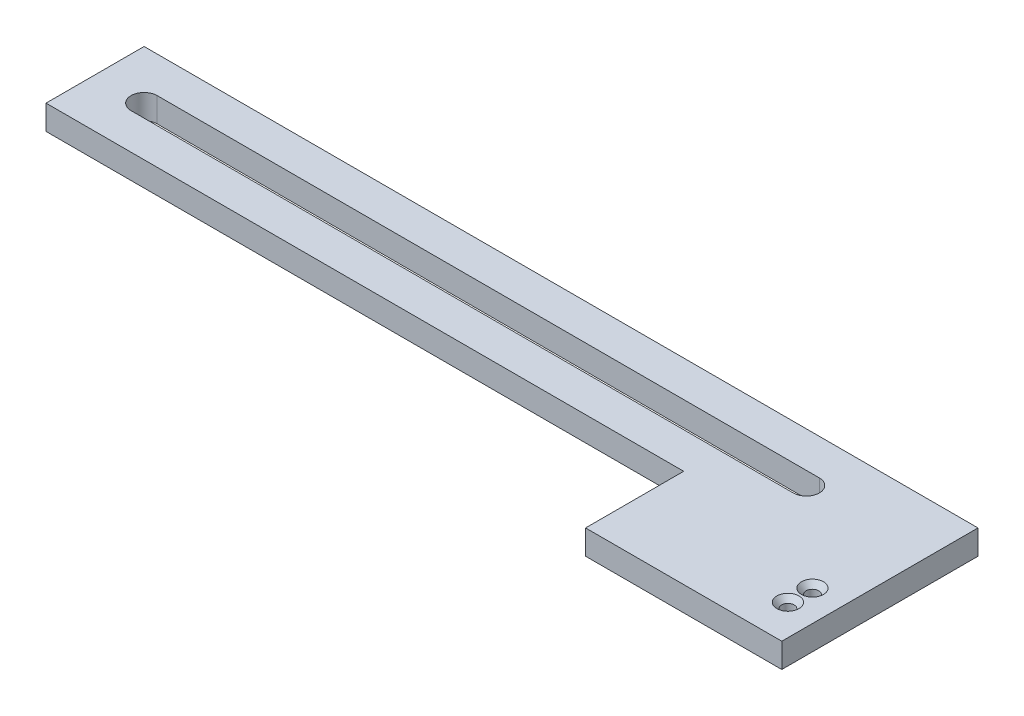
ISO-10303-21;
HEADER;
FILE_DESCRIPTION(('STEP AP214'),'2;1');
FILE_NAME('part.step','',(''),(''),'','','');
FILE_SCHEMA(('AUTOMOTIVE_DESIGN { 1 0 10303 214 1 1 1 1 }'));
ENDSEC;
DATA;
#1=APPLICATION_CONTEXT('core data for automotive mechanical design processes');
#2=APPLICATION_PROTOCOL_DEFINITION('international standard','automotive_design',2000,#1);
#3=PRODUCT_CONTEXT('',#1,'mechanical');
#4=PRODUCT('Part','Part','',(#3));
#5=PRODUCT_RELATED_PRODUCT_CATEGORY('part','',(#4));
#6=PRODUCT_DEFINITION_FORMATION('','',#4);
#7=PRODUCT_DEFINITION_CONTEXT('part definition',#1,'design');
#8=PRODUCT_DEFINITION('design','',#6,#7);
#9=PRODUCT_DEFINITION_SHAPE('','',#8);
#10=(LENGTH_UNIT() NAMED_UNIT(*) SI_UNIT(.MILLI.,.METRE.));
#11=(NAMED_UNIT(*) PLANE_ANGLE_UNIT() SI_UNIT($,.RADIAN.));
#12=(NAMED_UNIT(*) SI_UNIT($,.STERADIAN.) SOLID_ANGLE_UNIT());
#13=UNCERTAINTY_MEASURE_WITH_UNIT(LENGTH_MEASURE(1.E-05),#10,'distance_accuracy_value','');
#14=(GEOMETRIC_REPRESENTATION_CONTEXT(3) GLOBAL_UNCERTAINTY_ASSIGNED_CONTEXT((#13)) GLOBAL_UNIT_ASSIGNED_CONTEXT((#10,
#11,#12)) REPRESENTATION_CONTEXT('',''));
#15=CARTESIAN_POINT('',(0.,0.,0.));
#16=DIRECTION('',(0.,0.,1.));
#17=DIRECTION('',(1.,0.,0.));
#18=AXIS2_PLACEMENT_3D('',#15,#16,#17);
#19=CARTESIAN_POINT('',(0.,6.35,25.4));
#20=DIRECTION('',(1.,0.,0.));
#21=DIRECTION('',(0.,0.,-1.));
#22=AXIS2_PLACEMENT_3D('',#19,#20,#21);
#23=PLANE('',#22);
#24=DIRECTION('',(0.,0.,1.));
#25=VECTOR('',#24,1.);
#26=CARTESIAN_POINT('',(0.,0.,25.4));
#27=LINE('',#26,#25);
#28=CARTESIAN_POINT('',(0.,0.,0.));
#29=VERTEX_POINT('',#28);
#30=CARTESIAN_POINT('',(0.,0.,25.4));
#31=VERTEX_POINT('',#30);
#32=EDGE_CURVE('E173',#29,#31,#27,.T.);
#33=ORIENTED_EDGE('',*,*,#32,.T.);
#34=DIRECTION('',(0.,-1.,0.));
#35=VECTOR('',#34,1.);
#36=CARTESIAN_POINT('',(0.,6.35,25.4));
#37=LINE('',#36,#35);
#38=CARTESIAN_POINT('',(0.,6.35,25.4));
#39=VERTEX_POINT('',#38);
#40=EDGE_CURVE('E11',#39,#31,#37,.T.);
#41=ORIENTED_EDGE('',*,*,#40,.F.);
#42=DIRECTION('',(0.,0.,1.));
#43=VECTOR('',#42,1.);
#44=CARTESIAN_POINT('',(0.,6.35,25.4));
#45=LINE('',#44,#43);
#46=CARTESIAN_POINT('',(0.,6.35,0.));
#47=VERTEX_POINT('',#46);
#48=EDGE_CURVE('E177',#47,#39,#45,.T.);
#49=ORIENTED_EDGE('',*,*,#48,.F.);
#50=DIRECTION('',(0.,-1.,0.));
#51=VECTOR('',#50,1.);
#52=CARTESIAN_POINT('',(0.,6.35,0.));
#53=LINE('',#52,#51);
#54=EDGE_CURVE('E196',#47,#29,#53,.T.);
#55=ORIENTED_EDGE('',*,*,#54,.T.);
#56=EDGE_LOOP('',(#33,#41,#49,#55));
#57=FACE_BOUND('',#56,.T.);
#58=ADVANCED_FACE('F41',(#57),#23,.F.);
#59=CARTESIAN_POINT('',(165.1,6.35,25.4));
#60=DIRECTION('',(0.,0.,-1.));
#61=DIRECTION('',(-1.,0.,0.));
#62=AXIS2_PLACEMENT_3D('',#59,#60,#61);
#63=PLANE('',#62);
#64=DIRECTION('',(1.,0.,0.));
#65=VECTOR('',#64,1.);
#66=CARTESIAN_POINT('',(165.1,0.,25.4));
#67=LINE('',#66,#65);
#68=CARTESIAN_POINT('',(165.1,0.,25.4));
#69=VERTEX_POINT('',#68);
#70=EDGE_CURVE('E199',#31,#69,#67,.T.);
#71=ORIENTED_EDGE('',*,*,#70,.T.);
#72=DIRECTION('',(0.,-1.,0.));
#73=VECTOR('',#72,1.);
#74=CARTESIAN_POINT('',(165.1,6.35,25.4));
#75=LINE('',#74,#73);
#76=CARTESIAN_POINT('',(165.1,6.35,25.4));
#77=VERTEX_POINT('',#76);
#78=EDGE_CURVE('E48',#77,#69,#75,.T.);
#79=ORIENTED_EDGE('',*,*,#78,.F.);
#80=DIRECTION('',(1.,0.,0.));
#81=VECTOR('',#80,1.);
#82=CARTESIAN_POINT('',(165.1,6.35,25.4));
#83=LINE('',#82,#81);
#84=EDGE_CURVE('E180',#39,#77,#83,.T.);
#85=ORIENTED_EDGE('',*,*,#84,.F.);
#86=ORIENTED_EDGE('',*,*,#40,.T.);
#87=EDGE_LOOP('',(#71,#79,#85,#86));
#88=FACE_BOUND('',#87,.T.);
#89=ADVANCED_FACE('F253',(#88),#63,.F.);
#90=CARTESIAN_POINT('',(165.1,6.35,50.8));
#91=DIRECTION('',(1.,0.,0.));
#92=DIRECTION('',(0.,0.,-1.));
#93=AXIS2_PLACEMENT_3D('',#90,#91,#92);
#94=PLANE('',#93);
#95=DIRECTION('',(0.,0.,1.));
#96=VECTOR('',#95,1.);
#97=CARTESIAN_POINT('',(165.1,0.,50.8));
#98=LINE('',#97,#96);
#99=CARTESIAN_POINT('',(165.1,0.,50.8));
#100=VERTEX_POINT('',#99);
#101=EDGE_CURVE('E202',#69,#100,#98,.T.);
#102=ORIENTED_EDGE('',*,*,#101,.T.);
#103=DIRECTION('',(0.,-1.,0.));
#104=VECTOR('',#103,1.);
#105=CARTESIAN_POINT('',(165.1,6.35,50.8));
#106=LINE('',#105,#104);
#107=CARTESIAN_POINT('',(165.1,6.35,50.8));
#108=VERTEX_POINT('',#107);
#109=EDGE_CURVE('E223',#108,#100,#106,.T.);
#110=ORIENTED_EDGE('',*,*,#109,.F.);
#111=DIRECTION('',(0.,0.,1.));
#112=VECTOR('',#111,1.);
#113=CARTESIAN_POINT('',(165.1,6.35,50.8));
#114=LINE('',#113,#112);
#115=EDGE_CURVE('E184',#77,#108,#114,.T.);
#116=ORIENTED_EDGE('',*,*,#115,.F.);
#117=ORIENTED_EDGE('',*,*,#78,.T.);
#118=EDGE_LOOP('',(#102,#110,#116,#117));
#119=FACE_BOUND('',#118,.T.);
#120=ADVANCED_FACE('F232',(#119),#94,.F.);
#121=CARTESIAN_POINT('',(215.9,6.35,50.8));
#122=DIRECTION('',(0.,0.,-1.));
#123=DIRECTION('',(-1.,0.,0.));
#124=AXIS2_PLACEMENT_3D('',#121,#122,#123);
#125=PLANE('',#124);
#126=DIRECTION('',(1.,0.,0.));
#127=VECTOR('',#126,1.);
#128=CARTESIAN_POINT('',(215.9,0.,50.8));
#129=LINE('',#128,#127);
#130=CARTESIAN_POINT('',(215.9,0.,50.8));
#131=VERTEX_POINT('',#130);
#132=EDGE_CURVE('E205',#100,#131,#129,.T.);
#133=ORIENTED_EDGE('',*,*,#132,.T.);
#134=DIRECTION('',(0.,-1.,0.));
#135=VECTOR('',#134,1.);
#136=CARTESIAN_POINT('',(215.9,6.35,50.8));
#137=LINE('',#136,#135);
#138=CARTESIAN_POINT('',(215.9,6.35,50.8));
#139=VERTEX_POINT('',#138);
#140=EDGE_CURVE('E219',#139,#131,#137,.T.);
#141=ORIENTED_EDGE('',*,*,#140,.F.);
#142=DIRECTION('',(1.,0.,0.));
#143=VECTOR('',#142,1.);
#144=CARTESIAN_POINT('',(215.9,6.35,50.8));
#145=LINE('',#144,#143);
#146=EDGE_CURVE('E187',#108,#139,#145,.T.);
#147=ORIENTED_EDGE('',*,*,#146,.F.);
#148=ORIENTED_EDGE('',*,*,#109,.T.);
#149=EDGE_LOOP('',(#133,#141,#147,#148));
#150=FACE_BOUND('',#149,.T.);
#151=ADVANCED_FACE('F241',(#150),#125,.F.);
#152=CARTESIAN_POINT('',(215.9,6.35,0.));
#153=DIRECTION('',(-1.,0.,0.));
#154=DIRECTION('',(0.,0.,1.));
#155=AXIS2_PLACEMENT_3D('',#152,#153,#154);
#156=PLANE('',#155);
#157=DIRECTION('',(0.,0.,-1.));
#158=VECTOR('',#157,1.);
#159=CARTESIAN_POINT('',(215.9,0.,0.));
#160=LINE('',#159,#158);
#161=CARTESIAN_POINT('',(215.9,0.,0.));
#162=VERTEX_POINT('',#161);
#163=EDGE_CURVE('E208',#131,#162,#160,.T.);
#164=ORIENTED_EDGE('',*,*,#163,.T.);
#165=DIRECTION('',(0.,-1.,0.));
#166=VECTOR('',#165,1.);
#167=CARTESIAN_POINT('',(215.9,6.35,0.));
#168=LINE('',#167,#166);
#169=CARTESIAN_POINT('',(215.9,6.35,0.));
#170=VERTEX_POINT('',#169);
#171=EDGE_CURVE('E215',#170,#162,#168,.T.);
#172=ORIENTED_EDGE('',*,*,#171,.F.);
#173=DIRECTION('',(0.,0.,-1.));
#174=VECTOR('',#173,1.);
#175=CARTESIAN_POINT('',(215.9,6.35,0.));
#176=LINE('',#175,#174);
#177=EDGE_CURVE('E190',#139,#170,#176,.T.);
#178=ORIENTED_EDGE('',*,*,#177,.F.);
#179=ORIENTED_EDGE('',*,*,#140,.T.);
#180=EDGE_LOOP('',(#164,#172,#178,#179));
#181=FACE_BOUND('',#180,.T.);
#182=ADVANCED_FACE('F245',(#181),#156,.F.);
#183=CARTESIAN_POINT('',(0.,6.35,0.));
#184=DIRECTION('',(0.,0.,1.));
#185=DIRECTION('',(1.,0.,0.));
#186=AXIS2_PLACEMENT_3D('',#183,#184,#185);
#187=PLANE('',#186);
#188=DIRECTION('',(-1.,0.,0.));
#189=VECTOR('',#188,1.);
#190=CARTESIAN_POINT('',(0.,0.,0.));
#191=LINE('',#190,#189);
#192=EDGE_CURVE('E181',#162,#29,#191,.T.);
#193=ORIENTED_EDGE('',*,*,#192,.T.);
#194=ORIENTED_EDGE('',*,*,#54,.F.);
#195=DIRECTION('',(-1.,0.,0.));
#196=VECTOR('',#195,1.);
#197=CARTESIAN_POINT('',(0.,6.35,0.));
#198=LINE('',#197,#196);
#199=EDGE_CURVE('E193',#170,#47,#198,.T.);
#200=ORIENTED_EDGE('',*,*,#199,.F.);
#201=ORIENTED_EDGE('',*,*,#171,.T.);
#202=EDGE_LOOP('',(#193,#194,#200,#201));
#203=FACE_BOUND('',#202,.T.);
#204=ADVANCED_FACE('F256',(#203),#187,.F.);
#205=CARTESIAN_POINT('',(0.,6.35,0.));
#206=DIRECTION('',(0.,-1.,0.));
#207=DIRECTION('',(0.,0.,-1.));
#208=AXIS2_PLACEMENT_3D('',#205,#206,#207);
#209=PLANE('',#208);
#210=CARTESIAN_POINT('',(207.962499999999,6.35,34.925000000001));
#211=DIRECTION('',(0.,1.,0.));
#212=DIRECTION('',(0.,0.,1.));
#213=AXIS2_PLACEMENT_3D('',#210,#211,#212);
#214=CIRCLE('',#213,2.85750000000001);
#215=CARTESIAN_POINT('',(207.962499999999,6.35,37.782500000001));
#216=VERTEX_POINT('',#215);
#217=EDGE_CURVE('E423',#216,#216,#214,.T.);
#218=ORIENTED_EDGE('',*,*,#217,.F.);
#219=EDGE_LOOP('',(#218));
#220=FACE_BOUND('',#219,.T.);
#221=CARTESIAN_POINT('',(207.962499999999,6.35,41.275000000001));
#222=DIRECTION('',(0.,1.,0.));
#223=DIRECTION('',(0.,0.,1.));
#224=AXIS2_PLACEMENT_3D('',#221,#222,#223);
#225=CIRCLE('',#224,2.85750000000001);
#226=CARTESIAN_POINT('',(207.962499999999,6.35,44.132500000001));
#227=VERTEX_POINT('',#226);
#228=EDGE_CURVE('E412',#227,#227,#225,.T.);
#229=ORIENTED_EDGE('',*,*,#228,.F.);
#230=EDGE_LOOP('',(#229));
#231=FACE_BOUND('',#230,.T.);
#232=DIRECTION('',(-1.,0.,0.));
#233=VECTOR('',#232,1.);
#234=CARTESIAN_POINT('',(184.15,6.35,9.3218));
#235=LINE('',#234,#233);
#236=CARTESIAN_POINT('',(184.15,6.35,9.3218));
#237=VERTEX_POINT('',#236);
#238=CARTESIAN_POINT('',(12.7,6.35,9.32180000000002));
#239=VERTEX_POINT('',#238);
#240=EDGE_CURVE('E165',#237,#239,#235,.T.);
#241=ORIENTED_EDGE('',*,*,#240,.F.);
#242=CARTESIAN_POINT('',(184.15,6.35,12.7));
#243=DIRECTION('',(0.,1.,0.));
#244=DIRECTION('',(0.,0.,1.));
#245=AXIS2_PLACEMENT_3D('',#242,#243,#244);
#246=CIRCLE('',#245,3.3782);
#247=CARTESIAN_POINT('',(184.15,6.35,16.0782));
#248=VERTEX_POINT('',#247);
#249=EDGE_CURVE('E58',#248,#237,#246,.T.);
#250=ORIENTED_EDGE('',*,*,#249,.F.);
#251=DIRECTION('',(1.,0.,0.));
#252=VECTOR('',#251,1.);
#253=CARTESIAN_POINT('',(184.15,6.35,16.0782));
#254=LINE('',#253,#252);
#255=CARTESIAN_POINT('',(12.7,6.35,16.0782));
#256=VERTEX_POINT('',#255);
#257=EDGE_CURVE('E150',#256,#248,#254,.T.);
#258=ORIENTED_EDGE('',*,*,#257,.F.);
#259=CARTESIAN_POINT('',(12.7,6.35,12.7));
#260=DIRECTION('',(0.,1.,0.));
#261=DIRECTION('',(0.,0.,1.));
#262=AXIS2_PLACEMENT_3D('',#259,#260,#261);
#263=CIRCLE('',#262,3.3782);
#264=EDGE_CURVE('E155',#239,#256,#263,.T.);
#265=ORIENTED_EDGE('',*,*,#264,.F.);
#266=EDGE_LOOP('',(#241,#250,#258,#265));
#267=FACE_BOUND('',#266,.T.);
#268=ORIENTED_EDGE('',*,*,#48,.T.);
#269=ORIENTED_EDGE('',*,*,#84,.T.);
#270=ORIENTED_EDGE('',*,*,#115,.T.);
#271=ORIENTED_EDGE('',*,*,#146,.T.);
#272=ORIENTED_EDGE('',*,*,#177,.T.);
#273=ORIENTED_EDGE('',*,*,#199,.T.);
#274=EDGE_LOOP('',(#268,#269,#270,#271,#272,#273));
#275=FACE_BOUND('',#274,.T.);
#276=ADVANCED_FACE('F249',(#220,#231,#267,#275),#209,.F.);
#277=CARTESIAN_POINT('',(0.,0.,0.));
#278=DIRECTION('',(0.,-1.,0.));
#279=DIRECTION('',(0.,0.,-1.));
#280=AXIS2_PLACEMENT_3D('',#277,#278,#279);
#281=PLANE('',#280);
#282=CARTESIAN_POINT('',(207.962499999999,0.,34.925000000001));
#283=DIRECTION('',(0.,1.,0.));
#284=DIRECTION('',(0.,0.,1.));
#285=AXIS2_PLACEMENT_3D('',#282,#283,#284);
#286=CIRCLE('',#285,1.63194999999999);
#287=CARTESIAN_POINT('',(207.962499999999,0.,36.556950000001));
#288=VERTEX_POINT('',#287);
#289=EDGE_CURVE('E403',#288,#288,#286,.T.);
#290=ORIENTED_EDGE('',*,*,#289,.T.);
#291=EDGE_LOOP('',(#290));
#292=FACE_BOUND('',#291,.T.);
#293=CARTESIAN_POINT('',(207.962499999999,0.,41.275000000001));
#294=DIRECTION('',(0.,1.,0.));
#295=DIRECTION('',(0.,0.,1.));
#296=AXIS2_PLACEMENT_3D('',#293,#294,#295);
#297=CIRCLE('',#296,1.63194999999999);
#298=CARTESIAN_POINT('',(207.962499999999,0.,42.906950000001));
#299=VERTEX_POINT('',#298);
#300=EDGE_CURVE('E158',#299,#299,#297,.T.);
#301=ORIENTED_EDGE('',*,*,#300,.T.);
#302=EDGE_LOOP('',(#301));
#303=FACE_BOUND('',#302,.T.);
#304=CARTESIAN_POINT('',(184.15,0.,12.7));
#305=DIRECTION('',(0.,1.,0.));
#306=DIRECTION('',(0.,0.,1.));
#307=AXIS2_PLACEMENT_3D('',#304,#305,#306);
#308=CIRCLE('',#307,3.3782);
#309=CARTESIAN_POINT('',(184.15,0.,16.0782));
#310=VERTEX_POINT('',#309);
#311=CARTESIAN_POINT('',(184.15,0.,9.3218));
#312=VERTEX_POINT('',#311);
#313=EDGE_CURVE('E131',#310,#312,#308,.T.);
#314=ORIENTED_EDGE('',*,*,#313,.T.);
#315=DIRECTION('',(-1.,0.,0.));
#316=VECTOR('',#315,1.);
#317=CARTESIAN_POINT('',(184.15,0.,9.3218));
#318=LINE('',#317,#316);
#319=CARTESIAN_POINT('',(12.7,0.,9.32180000000002));
#320=VERTEX_POINT('',#319);
#321=EDGE_CURVE('E141',#312,#320,#318,.T.);
#322=ORIENTED_EDGE('',*,*,#321,.T.);
#323=CARTESIAN_POINT('',(12.7,0.,12.7));
#324=DIRECTION('',(0.,1.,0.));
#325=DIRECTION('',(0.,0.,1.));
#326=AXIS2_PLACEMENT_3D('',#323,#324,#325);
#327=CIRCLE('',#326,3.3782);
#328=CARTESIAN_POINT('',(12.7,0.,16.0782));
#329=VERTEX_POINT('',#328);
#330=EDGE_CURVE('E66',#320,#329,#327,.T.);
#331=ORIENTED_EDGE('',*,*,#330,.T.);
#332=DIRECTION('',(1.,0.,0.));
#333=VECTOR('',#332,1.);
#334=CARTESIAN_POINT('',(184.15,0.,16.0782));
#335=LINE('',#334,#333);
#336=EDGE_CURVE('E138',#329,#310,#335,.T.);
#337=ORIENTED_EDGE('',*,*,#336,.T.);
#338=EDGE_LOOP('',(#314,#322,#331,#337));
#339=FACE_BOUND('',#338,.T.);
#340=ORIENTED_EDGE('',*,*,#32,.F.);
#341=ORIENTED_EDGE('',*,*,#192,.F.);
#342=ORIENTED_EDGE('',*,*,#163,.F.);
#343=ORIENTED_EDGE('',*,*,#132,.F.);
#344=ORIENTED_EDGE('',*,*,#101,.F.);
#345=ORIENTED_EDGE('',*,*,#70,.F.);
#346=EDGE_LOOP('',(#340,#341,#342,#343,#344,#345));
#347=FACE_BOUND('',#346,.T.);
#348=ADVANCED_FACE('F146',(#292,#303,#339,#347),#281,.T.);
#349=CARTESIAN_POINT('',(184.15,0.,12.7));
#350=DIRECTION('',(0.,1.,0.));
#351=DIRECTION('',(0.,0.,1.));
#352=AXIS2_PLACEMENT_3D('',#349,#350,#351);
#353=CYLINDRICAL_SURFACE('',#352,3.3782);
#354=ORIENTED_EDGE('',*,*,#249,.T.);
#355=DIRECTION('',(0.,1.,0.));
#356=VECTOR('',#355,1.);
#357=CARTESIAN_POINT('',(184.15,0.,9.3218));
#358=LINE('',#357,#356);
#359=EDGE_CURVE('E127',#312,#237,#358,.T.);
#360=ORIENTED_EDGE('',*,*,#359,.F.);
#361=ORIENTED_EDGE('',*,*,#313,.F.);
#362=DIRECTION('',(0.,1.,0.));
#363=VECTOR('',#362,1.);
#364=CARTESIAN_POINT('',(184.15,0.,16.0782));
#365=LINE('',#364,#363);
#366=EDGE_CURVE('E170',#310,#248,#365,.T.);
#367=ORIENTED_EDGE('',*,*,#366,.T.);
#368=EDGE_LOOP('',(#354,#360,#361,#367));
#369=FACE_BOUND('',#368,.T.);
#370=ADVANCED_FACE('F129',(#369),#353,.F.);
#371=CARTESIAN_POINT('',(184.15,0.,16.0782));
#372=DIRECTION('',(0.,0.,1.));
#373=DIRECTION('',(1.,0.,0.));
#374=AXIS2_PLACEMENT_3D('',#371,#372,#373);
#375=PLANE('',#374);
#376=ORIENTED_EDGE('',*,*,#257,.T.);
#377=ORIENTED_EDGE('',*,*,#366,.F.);
#378=ORIENTED_EDGE('',*,*,#336,.F.);
#379=DIRECTION('',(0.,1.,0.));
#380=VECTOR('',#379,1.);
#381=CARTESIAN_POINT('',(12.7,0.,16.0782));
#382=LINE('',#381,#380);
#383=EDGE_CURVE('E174',#329,#256,#382,.T.);
#384=ORIENTED_EDGE('',*,*,#383,.T.);
#385=EDGE_LOOP('',(#376,#377,#378,#384));
#386=FACE_BOUND('',#385,.T.);
#387=ADVANCED_FACE('F348',(#386),#375,.F.);
#388=CARTESIAN_POINT('',(12.7,0.,12.7));
#389=DIRECTION('',(0.,1.,0.));
#390=DIRECTION('',(0.,0.,1.));
#391=AXIS2_PLACEMENT_3D('',#388,#389,#390);
#392=CYLINDRICAL_SURFACE('',#391,3.3782);
#393=ORIENTED_EDGE('',*,*,#264,.T.);
#394=ORIENTED_EDGE('',*,*,#383,.F.);
#395=ORIENTED_EDGE('',*,*,#330,.F.);
#396=DIRECTION('',(0.,1.,0.));
#397=VECTOR('',#396,1.);
#398=CARTESIAN_POINT('',(12.7,0.,9.32180000000002));
#399=LINE('',#398,#397);
#400=EDGE_CURVE('E137',#320,#239,#399,.T.);
#401=ORIENTED_EDGE('',*,*,#400,.T.);
#402=EDGE_LOOP('',(#393,#394,#395,#401));
#403=FACE_BOUND('',#402,.T.);
#404=ADVANCED_FACE('F341',(#403),#392,.F.);
#405=CARTESIAN_POINT('',(184.15,0.,9.3218));
#406=DIRECTION('',(0.,0.,-1.));
#407=DIRECTION('',(-1.,0.,0.));
#408=AXIS2_PLACEMENT_3D('',#405,#406,#407);
#409=PLANE('',#408);
#410=ORIENTED_EDGE('',*,*,#240,.T.);
#411=ORIENTED_EDGE('',*,*,#400,.F.);
#412=ORIENTED_EDGE('',*,*,#321,.F.);
#413=ORIENTED_EDGE('',*,*,#359,.T.);
#414=EDGE_LOOP('',(#410,#411,#412,#413));
#415=FACE_BOUND('',#414,.T.);
#416=ADVANCED_FACE('F142',(#415),#409,.F.);
#417=CARTESIAN_POINT('',(207.962499999999,6.35,41.275000000001));
#418=DIRECTION('',(0.,1.,0.));
#419=DIRECTION('',(0.,0.,1.));
#420=AXIS2_PLACEMENT_3D('',#417,#418,#419);
#421=CYLINDRICAL_SURFACE('',#420,1.63194999999999);
#422=ORIENTED_EDGE('',*,*,#300,.F.);
#423=EDGE_LOOP('',(#422));
#424=FACE_BOUND('',#423,.T.);
#425=CARTESIAN_POINT('',(207.962499999999,4.94016599853026,41.275000000001));
#426=DIRECTION('',(0.,1.,0.));
#427=DIRECTION('',(0.,0.,1.));
#428=AXIS2_PLACEMENT_3D('',#425,#426,#427);
#429=CIRCLE('',#428,1.63194999999999);
#430=CARTESIAN_POINT('',(207.962499999999,4.94016599853026,42.906950000001));
#431=VERTEX_POINT('',#430);
#432=EDGE_CURVE('E407',#431,#431,#429,.T.);
#433=ORIENTED_EDGE('',*,*,#432,.T.);
#434=EDGE_LOOP('',(#433));
#435=FACE_BOUND('',#434,.T.);
#436=ADVANCED_FACE('F292',(#424,#435),#421,.F.);
#437=CARTESIAN_POINT('',(207.962499999999,6.35,41.275000000001));
#438=DIRECTION('',(0.,1.,0.));
#439=DIRECTION('',(0.,0.,1.));
#440=AXIS2_PLACEMENT_3D('',#437,#438,#439);
#441=CONICAL_SURFACE('',#440,2.85750000000001,0.715584993317671);
#442=ORIENTED_EDGE('',*,*,#432,.F.);
#443=EDGE_LOOP('',(#442));
#444=FACE_BOUND('',#443,.T.);
#445=ORIENTED_EDGE('',*,*,#228,.T.);
#446=EDGE_LOOP('',(#445));
#447=FACE_BOUND('',#446,.T.);
#448=ADVANCED_FACE('F295',(#444,#447),#441,.F.);
#449=CARTESIAN_POINT('',(207.962499999999,6.35,34.925000000001));
#450=DIRECTION('',(0.,1.,0.));
#451=DIRECTION('',(0.,0.,1.));
#452=AXIS2_PLACEMENT_3D('',#449,#450,#451);
#453=CYLINDRICAL_SURFACE('',#452,1.63194999999999);
#454=ORIENTED_EDGE('',*,*,#289,.F.);
#455=EDGE_LOOP('',(#454));
#456=FACE_BOUND('',#455,.T.);
#457=CARTESIAN_POINT('',(207.962499999999,4.94016599853026,34.925000000001));
#458=DIRECTION('',(0.,1.,0.));
#459=DIRECTION('',(0.,0.,1.));
#460=AXIS2_PLACEMENT_3D('',#457,#458,#459);
#461=CIRCLE('',#460,1.63194999999999);
#462=CARTESIAN_POINT('',(207.962499999999,4.94016599853026,36.556950000001));
#463=VERTEX_POINT('',#462);
#464=EDGE_CURVE('E420',#463,#463,#461,.T.);
#465=ORIENTED_EDGE('',*,*,#464,.T.);
#466=EDGE_LOOP('',(#465));
#467=FACE_BOUND('',#466,.T.);
#468=ADVANCED_FACE('F310',(#456,#467),#453,.F.);
#469=CARTESIAN_POINT('',(207.962499999999,6.35,34.925000000001));
#470=DIRECTION('',(0.,1.,0.));
#471=DIRECTION('',(0.,0.,1.));
#472=AXIS2_PLACEMENT_3D('',#469,#470,#471);
#473=CONICAL_SURFACE('',#472,2.85750000000001,0.715584993317671);
#474=ORIENTED_EDGE('',*,*,#464,.F.);
#475=EDGE_LOOP('',(#474));
#476=FACE_BOUND('',#475,.T.);
#477=ORIENTED_EDGE('',*,*,#217,.T.);
#478=EDGE_LOOP('',(#477));
#479=FACE_BOUND('',#478,.T.);
#480=ADVANCED_FACE('F318',(#476,#479),#473,.F.);
#481=CLOSED_SHELL('',(#58,#89,#120,#151,#182,#204,#276,#348,#370,#387,#404,#416,#436,#448,#468,#480));
#482=MANIFOLD_SOLID_BREP('B2',#481);
#483=ADVANCED_BREP_SHAPE_REPRESENTATION('',(#18,#482),#14);
#484=SHAPE_DEFINITION_REPRESENTATION(#9,#483);
ENDSEC;
END-ISO-10303-21;
